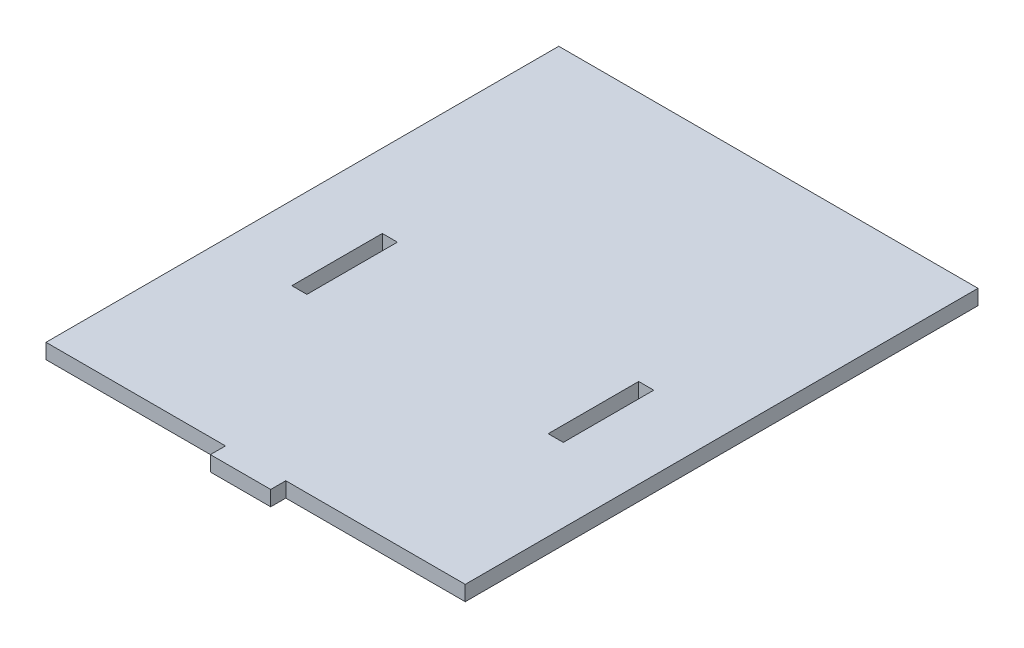
ISO-10303-21;
HEADER;
FILE_DESCRIPTION(('STEP AP214'),'2;1');
FILE_NAME('part.step','',(''),(''),'','','');
FILE_SCHEMA(('AUTOMOTIVE_DESIGN { 1 0 10303 214 1 1 1 1 }'));
ENDSEC;
DATA;
#1=APPLICATION_CONTEXT('core data for automotive mechanical design processes');
#2=APPLICATION_PROTOCOL_DEFINITION('international standard','automotive_design',2000,#1);
#3=PRODUCT_CONTEXT('',#1,'mechanical');
#4=PRODUCT('Part','Part','',(#3));
#5=PRODUCT_RELATED_PRODUCT_CATEGORY('part','',(#4));
#6=PRODUCT_DEFINITION_FORMATION('','',#4);
#7=PRODUCT_DEFINITION_CONTEXT('part definition',#1,'design');
#8=PRODUCT_DEFINITION('design','',#6,#7);
#9=PRODUCT_DEFINITION_SHAPE('','',#8);
#10=(LENGTH_UNIT() NAMED_UNIT(*) SI_UNIT(.MILLI.,.METRE.));
#11=(NAMED_UNIT(*) PLANE_ANGLE_UNIT() SI_UNIT($,.RADIAN.));
#12=(NAMED_UNIT(*) SI_UNIT($,.STERADIAN.) SOLID_ANGLE_UNIT());
#13=UNCERTAINTY_MEASURE_WITH_UNIT(LENGTH_MEASURE(1.E-05),#10,'distance_accuracy_value','');
#14=(GEOMETRIC_REPRESENTATION_CONTEXT(3) GLOBAL_UNCERTAINTY_ASSIGNED_CONTEXT((#13)) GLOBAL_UNIT_ASSIGNED_CONTEXT((#10,
#11,#12)) REPRESENTATION_CONTEXT('',''));
#15=CARTESIAN_POINT('',(0.,0.,0.));
#16=DIRECTION('',(0.,0.,1.));
#17=DIRECTION('',(1.,0.,0.));
#18=AXIS2_PLACEMENT_3D('',#15,#16,#17);
#19=CARTESIAN_POINT('',(69.5,5.,0.));
#20=DIRECTION('',(-1.,0.,0.));
#21=DIRECTION('',(0.,0.,1.));
#22=AXIS2_PLACEMENT_3D('',#19,#20,#21);
#23=PLANE('',#22);
#24=DIRECTION('',(0.,0.,-1.));
#25=VECTOR('',#24,1.);
#26=CARTESIAN_POINT('',(69.5,0.,0.));
#27=LINE('',#26,#25);
#28=CARTESIAN_POINT('',(69.5,0.,72.));
#29=VERTEX_POINT('',#28);
#30=CARTESIAN_POINT('',(69.5,0.,-98.));
#31=VERTEX_POINT('',#30);
#32=EDGE_CURVE('E211',#29,#31,#27,.T.);
#33=ORIENTED_EDGE('',*,*,#32,.T.);
#34=DIRECTION('',(0.,-1.,0.));
#35=VECTOR('',#34,1.);
#36=CARTESIAN_POINT('',(69.5,5.,-98.));
#37=LINE('',#36,#35);
#38=CARTESIAN_POINT('',(69.5,5.,-98.));
#39=VERTEX_POINT('',#38);
#40=EDGE_CURVE('E11',#39,#31,#37,.T.);
#41=ORIENTED_EDGE('',*,*,#40,.F.);
#42=DIRECTION('',(0.,0.,-1.));
#43=VECTOR('',#42,1.);
#44=CARTESIAN_POINT('',(69.5,5.,0.));
#45=LINE('',#44,#43);
#46=CARTESIAN_POINT('',(69.5,5.,72.));
#47=VERTEX_POINT('',#46);
#48=EDGE_CURVE('E338',#47,#39,#45,.T.);
#49=ORIENTED_EDGE('',*,*,#48,.F.);
#50=DIRECTION('',(0.,-1.,0.));
#51=VECTOR('',#50,1.);
#52=CARTESIAN_POINT('',(69.5,5.,72.));
#53=LINE('',#52,#51);
#54=EDGE_CURVE('E54',#47,#29,#53,.T.);
#55=ORIENTED_EDGE('',*,*,#54,.T.);
#56=EDGE_LOOP('',(#33,#41,#49,#55));
#57=FACE_BOUND('',#56,.T.);
#58=ADVANCED_FACE('F35',(#57),#23,.F.);
#59=CARTESIAN_POINT('',(0.,5.,-98.));
#60=DIRECTION('',(0.,0.,1.));
#61=DIRECTION('',(1.,0.,0.));
#62=AXIS2_PLACEMENT_3D('',#59,#60,#61);
#63=PLANE('',#62);
#64=DIRECTION('',(-1.,0.,0.));
#65=VECTOR('',#64,1.);
#66=CARTESIAN_POINT('',(0.,0.,-98.));
#67=LINE('',#66,#65);
#68=CARTESIAN_POINT('',(-69.5,0.,-98.));
#69=VERTEX_POINT('',#68);
#70=EDGE_CURVE('E213',#31,#69,#67,.T.);
#71=ORIENTED_EDGE('',*,*,#70,.T.);
#72=DIRECTION('',(0.,-1.,0.));
#73=VECTOR('',#72,1.);
#74=CARTESIAN_POINT('',(-69.5,5.,-98.));
#75=LINE('',#74,#73);
#76=CARTESIAN_POINT('',(-69.5,5.,-98.));
#77=VERTEX_POINT('',#76);
#78=EDGE_CURVE('E45',#77,#69,#75,.T.);
#79=ORIENTED_EDGE('',*,*,#78,.F.);
#80=DIRECTION('',(-1.,0.,0.));
#81=VECTOR('',#80,1.);
#82=CARTESIAN_POINT('',(0.,5.,-98.));
#83=LINE('',#82,#81);
#84=EDGE_CURVE('E334',#39,#77,#83,.T.);
#85=ORIENTED_EDGE('',*,*,#84,.F.);
#86=ORIENTED_EDGE('',*,*,#40,.T.);
#87=EDGE_LOOP('',(#71,#79,#85,#86));
#88=FACE_BOUND('',#87,.T.);
#89=ADVANCED_FACE('F281',(#88),#63,.F.);
#90=CARTESIAN_POINT('',(-69.5,5.,0.));
#91=DIRECTION('',(-1.,0.,0.));
#92=DIRECTION('',(0.,0.,1.));
#93=AXIS2_PLACEMENT_3D('',#90,#91,#92);
#94=PLANE('',#93);
#95=DIRECTION('',(0.,0.,-1.));
#96=VECTOR('',#95,1.);
#97=CARTESIAN_POINT('',(-69.5,0.,0.));
#98=LINE('',#97,#96);
#99=CARTESIAN_POINT('',(-69.5,0.,72.));
#100=VERTEX_POINT('',#99);
#101=EDGE_CURVE('E216',#100,#69,#98,.T.);
#102=ORIENTED_EDGE('',*,*,#101,.F.);
#103=DIRECTION('',(0.,-1.,0.));
#104=VECTOR('',#103,1.);
#105=CARTESIAN_POINT('',(-69.5,5.,72.));
#106=LINE('',#105,#104);
#107=CARTESIAN_POINT('',(-69.5,5.,72.));
#108=VERTEX_POINT('',#107);
#109=EDGE_CURVE('E234',#108,#100,#106,.T.);
#110=ORIENTED_EDGE('',*,*,#109,.F.);
#111=DIRECTION('',(0.,0.,-1.));
#112=VECTOR('',#111,1.);
#113=CARTESIAN_POINT('',(-69.5,5.,0.));
#114=LINE('',#113,#112);
#115=EDGE_CURVE('E333',#108,#77,#114,.T.);
#116=ORIENTED_EDGE('',*,*,#115,.T.);
#117=ORIENTED_EDGE('',*,*,#78,.T.);
#118=EDGE_LOOP('',(#102,#110,#116,#117));
#119=FACE_BOUND('',#118,.T.);
#120=ADVANCED_FACE('F286',(#119),#94,.T.);
#121=CARTESIAN_POINT('',(0.,5.,72.));
#122=DIRECTION('',(0.,0.,1.));
#123=DIRECTION('',(1.,0.,0.));
#124=AXIS2_PLACEMENT_3D('',#121,#122,#123);
#125=PLANE('',#124);
#126=DIRECTION('',(-1.,0.,0.));
#127=VECTOR('',#126,1.);
#128=CARTESIAN_POINT('',(0.,0.,72.));
#129=LINE('',#128,#127);
#130=CARTESIAN_POINT('',(-9.99999999999999,0.,72.));
#131=VERTEX_POINT('',#130);
#132=EDGE_CURVE('E219',#131,#100,#129,.T.);
#133=ORIENTED_EDGE('',*,*,#132,.F.);
#134=DIRECTION('',(0.,-1.,0.));
#135=VECTOR('',#134,1.);
#136=CARTESIAN_POINT('',(-9.99999999999999,5.,72.));
#137=LINE('',#136,#135);
#138=CARTESIAN_POINT('',(-9.99999999999999,5.,72.));
#139=VERTEX_POINT('',#138);
#140=EDGE_CURVE('E232',#139,#131,#137,.T.);
#141=ORIENTED_EDGE('',*,*,#140,.F.);
#142=DIRECTION('',(-1.,0.,0.));
#143=VECTOR('',#142,1.);
#144=CARTESIAN_POINT('',(0.,5.,72.));
#145=LINE('',#144,#143);
#146=EDGE_CURVE('E184',#139,#108,#145,.T.);
#147=ORIENTED_EDGE('',*,*,#146,.T.);
#148=ORIENTED_EDGE('',*,*,#109,.T.);
#149=EDGE_LOOP('',(#133,#141,#147,#148));
#150=FACE_BOUND('',#149,.T.);
#151=ADVANCED_FACE('F308',(#150),#125,.T.);
#152=CARTESIAN_POINT('',(-9.99999999999999,5.,0.));
#153=DIRECTION('',(1.,0.,0.));
#154=DIRECTION('',(0.,0.,-1.));
#155=AXIS2_PLACEMENT_3D('',#152,#153,#154);
#156=PLANE('',#155);
#157=DIRECTION('',(0.,0.,1.));
#158=VECTOR('',#157,1.);
#159=CARTESIAN_POINT('',(-9.99999999999999,0.,0.));
#160=LINE('',#159,#158);
#161=CARTESIAN_POINT('',(-9.99999999999999,0.,77.));
#162=VERTEX_POINT('',#161);
#163=EDGE_CURVE('E222',#131,#162,#160,.T.);
#164=ORIENTED_EDGE('',*,*,#163,.T.);
#165=DIRECTION('',(0.,-1.,0.));
#166=VECTOR('',#165,1.);
#167=CARTESIAN_POINT('',(-9.99999999999999,5.,77.));
#168=LINE('',#167,#166);
#169=CARTESIAN_POINT('',(-9.99999999999999,5.,77.));
#170=VERTEX_POINT('',#169);
#171=EDGE_CURVE('E177',#170,#162,#168,.T.);
#172=ORIENTED_EDGE('',*,*,#171,.F.);
#173=DIRECTION('',(0.,0.,1.));
#174=VECTOR('',#173,1.);
#175=CARTESIAN_POINT('',(-9.99999999999999,5.,0.));
#176=LINE('',#175,#174);
#177=EDGE_CURVE('E165',#139,#170,#176,.T.);
#178=ORIENTED_EDGE('',*,*,#177,.F.);
#179=ORIENTED_EDGE('',*,*,#140,.T.);
#180=EDGE_LOOP('',(#164,#172,#178,#179));
#181=FACE_BOUND('',#180,.T.);
#182=ADVANCED_FACE('F317',(#181),#156,.F.);
#183=CARTESIAN_POINT('',(0.,5.,77.));
#184=DIRECTION('',(0.,0.,-1.));
#185=DIRECTION('',(-1.,0.,0.));
#186=AXIS2_PLACEMENT_3D('',#183,#184,#185);
#187=PLANE('',#186);
#188=DIRECTION('',(1.,0.,0.));
#189=VECTOR('',#188,1.);
#190=CARTESIAN_POINT('',(0.,0.,77.));
#191=LINE('',#190,#189);
#192=CARTESIAN_POINT('',(10.,0.,77.));
#193=VERTEX_POINT('',#192);
#194=EDGE_CURVE('E174',#162,#193,#191,.T.);
#195=ORIENTED_EDGE('',*,*,#194,.T.);
#196=DIRECTION('',(0.,-1.,0.));
#197=VECTOR('',#196,1.);
#198=CARTESIAN_POINT('',(10.,5.,77.));
#199=LINE('',#198,#197);
#200=CARTESIAN_POINT('',(10.,5.,77.));
#201=VERTEX_POINT('',#200);
#202=EDGE_CURVE('E171',#201,#193,#199,.T.);
#203=ORIENTED_EDGE('',*,*,#202,.F.);
#204=DIRECTION('',(1.,0.,0.));
#205=VECTOR('',#204,1.);
#206=CARTESIAN_POINT('',(0.,5.,77.));
#207=LINE('',#206,#205);
#208=EDGE_CURVE('E156',#170,#201,#207,.T.);
#209=ORIENTED_EDGE('',*,*,#208,.F.);
#210=ORIENTED_EDGE('',*,*,#171,.T.);
#211=EDGE_LOOP('',(#195,#203,#209,#210));
#212=FACE_BOUND('',#211,.T.);
#213=ADVANCED_FACE('F172',(#212),#187,.F.);
#214=CARTESIAN_POINT('',(10.,5.,0.));
#215=DIRECTION('',(-1.,0.,0.));
#216=DIRECTION('',(0.,0.,1.));
#217=AXIS2_PLACEMENT_3D('',#214,#215,#216);
#218=PLANE('',#217);
#219=DIRECTION('',(0.,0.,-1.));
#220=VECTOR('',#219,1.);
#221=CARTESIAN_POINT('',(10.,0.,0.));
#222=LINE('',#221,#220);
#223=CARTESIAN_POINT('',(10.,0.,72.));
#224=VERTEX_POINT('',#223);
#225=EDGE_CURVE('E226',#193,#224,#222,.T.);
#226=ORIENTED_EDGE('',*,*,#225,.T.);
#227=DIRECTION('',(0.,-1.,0.));
#228=VECTOR('',#227,1.);
#229=CARTESIAN_POINT('',(10.,5.,72.));
#230=LINE('',#229,#228);
#231=CARTESIAN_POINT('',(10.,5.,72.));
#232=VERTEX_POINT('',#231);
#233=EDGE_CURVE('E105',#232,#224,#230,.T.);
#234=ORIENTED_EDGE('',*,*,#233,.F.);
#235=DIRECTION('',(0.,0.,-1.));
#236=VECTOR('',#235,1.);
#237=CARTESIAN_POINT('',(10.,5.,0.));
#238=LINE('',#237,#236);
#239=EDGE_CURVE('E162',#201,#232,#238,.T.);
#240=ORIENTED_EDGE('',*,*,#239,.F.);
#241=ORIENTED_EDGE('',*,*,#202,.T.);
#242=EDGE_LOOP('',(#226,#234,#240,#241));
#243=FACE_BOUND('',#242,.T.);
#244=ADVANCED_FACE('F179',(#243),#218,.F.);
#245=CARTESIAN_POINT('',(-45.,5.,0.));
#246=DIRECTION('',(1.,0.,0.));
#247=DIRECTION('',(0.,0.,-1.));
#248=AXIS2_PLACEMENT_3D('',#245,#246,#247);
#249=PLANE('',#248);
#250=DIRECTION('',(0.,0.,1.));
#251=VECTOR('',#250,1.);
#252=CARTESIAN_POINT('',(-45.,0.,0.));
#253=LINE('',#252,#251);
#254=CARTESIAN_POINT('',(-45.,0.,-15.));
#255=VERTEX_POINT('',#254);
#256=CARTESIAN_POINT('',(-45.,0.,15.));
#257=VERTEX_POINT('',#256);
#258=EDGE_CURVE('E199',#255,#257,#253,.T.);
#259=ORIENTED_EDGE('',*,*,#258,.F.);
#260=DIRECTION('',(0.,-1.,0.));
#261=VECTOR('',#260,1.);
#262=CARTESIAN_POINT('',(-45.,5.,-15.));
#263=LINE('',#262,#261);
#264=CARTESIAN_POINT('',(-45.,5.,-15.));
#265=VERTEX_POINT('',#264);
#266=EDGE_CURVE('E229',#265,#255,#263,.T.);
#267=ORIENTED_EDGE('',*,*,#266,.F.);
#268=DIRECTION('',(0.,0.,1.));
#269=VECTOR('',#268,1.);
#270=CARTESIAN_POINT('',(-45.,5.,0.));
#271=LINE('',#270,#269);
#272=CARTESIAN_POINT('',(-45.,5.,15.));
#273=VERTEX_POINT('',#272);
#274=EDGE_CURVE('E348',#265,#273,#271,.T.);
#275=ORIENTED_EDGE('',*,*,#274,.T.);
#276=DIRECTION('',(0.,-1.,0.));
#277=VECTOR('',#276,1.);
#278=CARTESIAN_POINT('',(-45.,5.,15.));
#279=LINE('',#278,#277);
#280=EDGE_CURVE('E237',#273,#257,#279,.T.);
#281=ORIENTED_EDGE('',*,*,#280,.T.);
#282=EDGE_LOOP('',(#259,#267,#275,#281));
#283=FACE_BOUND('',#282,.T.);
#284=ADVANCED_FACE('F298',(#283),#249,.T.);
#285=CARTESIAN_POINT('',(0.,5.,-15.0000000000001));
#286=DIRECTION('',(0.,0.,-1.));
#287=DIRECTION('',(-1.,0.,0.));
#288=AXIS2_PLACEMENT_3D('',#285,#286,#287);
#289=PLANE('',#288);
#290=DIRECTION('',(1.,0.,0.));
#291=VECTOR('',#290,1.);
#292=CARTESIAN_POINT('',(0.,0.,-15.0000000000001));
#293=LINE('',#292,#291);
#294=CARTESIAN_POINT('',(-40.,0.,-15.));
#295=VERTEX_POINT('',#294);
#296=EDGE_CURVE('E202',#255,#295,#293,.T.);
#297=ORIENTED_EDGE('',*,*,#296,.T.);
#298=DIRECTION('',(0.,-1.,0.));
#299=VECTOR('',#298,1.);
#300=CARTESIAN_POINT('',(-40.,5.,-15.));
#301=LINE('',#300,#299);
#302=CARTESIAN_POINT('',(-40.,5.,-15.));
#303=VERTEX_POINT('',#302);
#304=EDGE_CURVE('E242',#303,#295,#301,.T.);
#305=ORIENTED_EDGE('',*,*,#304,.F.);
#306=DIRECTION('',(1.,0.,0.));
#307=VECTOR('',#306,1.);
#308=CARTESIAN_POINT('',(0.,5.,-15.0000000000001));
#309=LINE('',#308,#307);
#310=EDGE_CURVE('E345',#265,#303,#309,.T.);
#311=ORIENTED_EDGE('',*,*,#310,.F.);
#312=ORIENTED_EDGE('',*,*,#266,.T.);
#313=EDGE_LOOP('',(#297,#305,#311,#312));
#314=FACE_BOUND('',#313,.T.);
#315=ADVANCED_FACE('F294',(#314),#289,.F.);
#316=CARTESIAN_POINT('',(-40.,5.,0.));
#317=DIRECTION('',(1.,0.,0.));
#318=DIRECTION('',(0.,0.,-1.));
#319=AXIS2_PLACEMENT_3D('',#316,#317,#318);
#320=PLANE('',#319);
#321=DIRECTION('',(0.,0.,1.));
#322=VECTOR('',#321,1.);
#323=CARTESIAN_POINT('',(-40.,0.,0.));
#324=LINE('',#323,#322);
#325=CARTESIAN_POINT('',(-40.,0.,15.));
#326=VERTEX_POINT('',#325);
#327=EDGE_CURVE('E205',#295,#326,#324,.T.);
#328=ORIENTED_EDGE('',*,*,#327,.T.);
#329=DIRECTION('',(0.,-1.,0.));
#330=VECTOR('',#329,1.);
#331=CARTESIAN_POINT('',(-40.,5.,15.));
#332=LINE('',#331,#330);
#333=CARTESIAN_POINT('',(-40.,5.,15.));
#334=VERTEX_POINT('',#333);
#335=EDGE_CURVE('E239',#334,#326,#332,.T.);
#336=ORIENTED_EDGE('',*,*,#335,.F.);
#337=DIRECTION('',(0.,0.,1.));
#338=VECTOR('',#337,1.);
#339=CARTESIAN_POINT('',(-40.,5.,0.));
#340=LINE('',#339,#338);
#341=EDGE_CURVE('E342',#303,#334,#340,.T.);
#342=ORIENTED_EDGE('',*,*,#341,.F.);
#343=ORIENTED_EDGE('',*,*,#304,.T.);
#344=EDGE_LOOP('',(#328,#336,#342,#343));
#345=FACE_BOUND('',#344,.T.);
#346=ADVANCED_FACE('F291',(#345),#320,.F.);
#347=CARTESIAN_POINT('',(0.,5.,-15.0000000000001));
#348=DIRECTION('',(0.,0.,1.));
#349=DIRECTION('',(1.,0.,0.));
#350=AXIS2_PLACEMENT_3D('',#347,#348,#349);
#351=PLANE('',#350);
#352=DIRECTION('',(-1.,0.,0.));
#353=VECTOR('',#352,1.);
#354=CARTESIAN_POINT('',(0.,0.,-15.0000000000001));
#355=LINE('',#354,#353);
#356=CARTESIAN_POINT('',(45.,0.,-15.));
#357=VERTEX_POINT('',#356);
#358=CARTESIAN_POINT('',(40.,0.,-15.));
#359=VERTEX_POINT('',#358);
#360=EDGE_CURVE('E187',#357,#359,#355,.T.);
#361=ORIENTED_EDGE('',*,*,#360,.F.);
#362=DIRECTION('',(0.,-1.,0.));
#363=VECTOR('',#362,1.);
#364=CARTESIAN_POINT('',(45.,5.,-15.));
#365=LINE('',#364,#363);
#366=CARTESIAN_POINT('',(45.,5.,-15.));
#367=VERTEX_POINT('',#366);
#368=EDGE_CURVE('E39',#367,#357,#365,.T.);
#369=ORIENTED_EDGE('',*,*,#368,.F.);
#370=DIRECTION('',(-1.,0.,0.));
#371=VECTOR('',#370,1.);
#372=CARTESIAN_POINT('',(0.,5.,-15.0000000000001));
#373=LINE('',#372,#371);
#374=CARTESIAN_POINT('',(40.,5.,-15.));
#375=VERTEX_POINT('',#374);
#376=EDGE_CURVE('E262',#367,#375,#373,.T.);
#377=ORIENTED_EDGE('',*,*,#376,.T.);
#378=DIRECTION('',(0.,-1.,0.));
#379=VECTOR('',#378,1.);
#380=CARTESIAN_POINT('',(40.,5.,-15.));
#381=LINE('',#380,#379);
#382=EDGE_CURVE('E182',#375,#359,#381,.T.);
#383=ORIENTED_EDGE('',*,*,#382,.T.);
#384=EDGE_LOOP('',(#361,#369,#377,#383));
#385=FACE_BOUND('',#384,.T.);
#386=ADVANCED_FACE('F37',(#385),#351,.T.);
#387=CARTESIAN_POINT('',(45.,5.,0.));
#388=DIRECTION('',(1.,0.,0.));
#389=DIRECTION('',(0.,0.,-1.));
#390=AXIS2_PLACEMENT_3D('',#387,#388,#389);
#391=PLANE('',#390);
#392=DIRECTION('',(0.,0.,1.));
#393=VECTOR('',#392,1.);
#394=CARTESIAN_POINT('',(45.,0.,0.));
#395=LINE('',#394,#393);
#396=CARTESIAN_POINT('',(45.,0.,15.));
#397=VERTEX_POINT('',#396);
#398=EDGE_CURVE('E190',#357,#397,#395,.T.);
#399=ORIENTED_EDGE('',*,*,#398,.T.);
#400=DIRECTION('',(0.,-1.,0.));
#401=VECTOR('',#400,1.);
#402=CARTESIAN_POINT('',(45.,5.,15.));
#403=LINE('',#402,#401);
#404=CARTESIAN_POINT('',(45.,5.,15.));
#405=VERTEX_POINT('',#404);
#406=EDGE_CURVE('E248',#405,#397,#403,.T.);
#407=ORIENTED_EDGE('',*,*,#406,.F.);
#408=DIRECTION('',(0.,0.,1.));
#409=VECTOR('',#408,1.);
#410=CARTESIAN_POINT('',(45.,5.,0.));
#411=LINE('',#410,#409);
#412=EDGE_CURVE('E256',#367,#405,#411,.T.);
#413=ORIENTED_EDGE('',*,*,#412,.F.);
#414=ORIENTED_EDGE('',*,*,#368,.T.);
#415=EDGE_LOOP('',(#399,#407,#413,#414));
#416=FACE_BOUND('',#415,.T.);
#417=ADVANCED_FACE('F255',(#416),#391,.F.);
#418=CARTESIAN_POINT('',(0.,5.,14.9999999999999));
#419=DIRECTION('',(0.,0.,-1.));
#420=DIRECTION('',(-1.,0.,0.));
#421=AXIS2_PLACEMENT_3D('',#418,#419,#420);
#422=PLANE('',#421);
#423=DIRECTION('',(1.,0.,0.));
#424=VECTOR('',#423,1.);
#425=CARTESIAN_POINT('',(0.,0.,14.9999999999999));
#426=LINE('',#425,#424);
#427=CARTESIAN_POINT('',(40.,0.,15.));
#428=VERTEX_POINT('',#427);
#429=EDGE_CURVE('E193',#428,#397,#426,.T.);
#430=ORIENTED_EDGE('',*,*,#429,.F.);
#431=DIRECTION('',(0.,-1.,0.));
#432=VECTOR('',#431,1.);
#433=CARTESIAN_POINT('',(40.,5.,15.));
#434=LINE('',#433,#432);
#435=CARTESIAN_POINT('',(40.,5.,15.));
#436=VERTEX_POINT('',#435);
#437=EDGE_CURVE('E247',#436,#428,#434,.T.);
#438=ORIENTED_EDGE('',*,*,#437,.F.);
#439=DIRECTION('',(1.,0.,0.));
#440=VECTOR('',#439,1.);
#441=CARTESIAN_POINT('',(0.,5.,14.9999999999999));
#442=LINE('',#441,#440);
#443=EDGE_CURVE('E352',#436,#405,#442,.T.);
#444=ORIENTED_EDGE('',*,*,#443,.T.);
#445=ORIENTED_EDGE('',*,*,#406,.T.);
#446=EDGE_LOOP('',(#430,#438,#444,#445));
#447=FACE_BOUND('',#446,.T.);
#448=ADVANCED_FACE('F269',(#447),#422,.T.);
#449=CARTESIAN_POINT('',(0.,5.,14.9999999999999));
#450=DIRECTION('',(0.,0.,1.));
#451=DIRECTION('',(1.,0.,0.));
#452=AXIS2_PLACEMENT_3D('',#449,#450,#451);
#453=PLANE('',#452);
#454=DIRECTION('',(-1.,0.,0.));
#455=VECTOR('',#454,1.);
#456=CARTESIAN_POINT('',(0.,0.,14.9999999999999));
#457=LINE('',#456,#455);
#458=EDGE_CURVE('E208',#326,#257,#457,.T.);
#459=ORIENTED_EDGE('',*,*,#458,.T.);
#460=ORIENTED_EDGE('',*,*,#280,.F.);
#461=DIRECTION('',(-1.,0.,0.));
#462=VECTOR('',#461,1.);
#463=CARTESIAN_POINT('',(0.,5.,14.9999999999999));
#464=LINE('',#463,#462);
#465=EDGE_CURVE('E340',#334,#273,#464,.T.);
#466=ORIENTED_EDGE('',*,*,#465,.F.);
#467=ORIENTED_EDGE('',*,*,#335,.T.);
#468=EDGE_LOOP('',(#459,#460,#466,#467));
#469=FACE_BOUND('',#468,.T.);
#470=ADVANCED_FACE('F271',(#469),#453,.F.);
#471=CARTESIAN_POINT('',(40.,5.,0.));
#472=DIRECTION('',(1.,0.,0.));
#473=DIRECTION('',(0.,0.,-1.));
#474=AXIS2_PLACEMENT_3D('',#471,#472,#473);
#475=PLANE('',#474);
#476=DIRECTION('',(0.,0.,1.));
#477=VECTOR('',#476,1.);
#478=CARTESIAN_POINT('',(40.,0.,0.));
#479=LINE('',#478,#477);
#480=EDGE_CURVE('E196',#359,#428,#479,.T.);
#481=ORIENTED_EDGE('',*,*,#480,.F.);
#482=ORIENTED_EDGE('',*,*,#382,.F.);
#483=DIRECTION('',(0.,0.,1.));
#484=VECTOR('',#483,1.);
#485=CARTESIAN_POINT('',(40.,5.,0.));
#486=LINE('',#485,#484);
#487=EDGE_CURVE('E267',#375,#436,#486,.T.);
#488=ORIENTED_EDGE('',*,*,#487,.T.);
#489=ORIENTED_EDGE('',*,*,#437,.T.);
#490=EDGE_LOOP('',(#481,#482,#488,#489));
#491=FACE_BOUND('',#490,.T.);
#492=ADVANCED_FACE('F266',(#491),#475,.T.);
#493=EDGE_CURVE('E223',#29,#224,#129,.T.);
#494=ORIENTED_EDGE('',*,*,#493,.F.);
#495=ORIENTED_EDGE('',*,*,#54,.F.);
#496=EDGE_CURVE('E180',#47,#232,#145,.T.);
#497=ORIENTED_EDGE('',*,*,#496,.T.);
#498=ORIENTED_EDGE('',*,*,#233,.T.);
#499=EDGE_LOOP('',(#494,#495,#497,#498));
#500=FACE_BOUND('',#499,.T.);
#501=ADVANCED_FACE('F303',(#500),#125,.T.);
#502=CARTESIAN_POINT('',(0.,5.,0.));
#503=DIRECTION('',(0.,1.,0.));
#504=DIRECTION('',(0.,0.,1.));
#505=AXIS2_PLACEMENT_3D('',#502,#503,#504);
#506=PLANE('',#505);
#507=ORIENTED_EDGE('',*,*,#376,.F.);
#508=ORIENTED_EDGE('',*,*,#412,.T.);
#509=ORIENTED_EDGE('',*,*,#443,.F.);
#510=ORIENTED_EDGE('',*,*,#487,.F.);
#511=EDGE_LOOP('',(#507,#508,#509,#510));
#512=FACE_BOUND('',#511,.T.);
#513=ORIENTED_EDGE('',*,*,#274,.F.);
#514=ORIENTED_EDGE('',*,*,#310,.T.);
#515=ORIENTED_EDGE('',*,*,#341,.T.);
#516=ORIENTED_EDGE('',*,*,#465,.T.);
#517=EDGE_LOOP('',(#513,#514,#515,#516));
#518=FACE_BOUND('',#517,.T.);
#519=ORIENTED_EDGE('',*,*,#48,.T.);
#520=ORIENTED_EDGE('',*,*,#84,.T.);
#521=ORIENTED_EDGE('',*,*,#115,.F.);
#522=ORIENTED_EDGE('',*,*,#146,.F.);
#523=ORIENTED_EDGE('',*,*,#177,.T.);
#524=ORIENTED_EDGE('',*,*,#208,.T.);
#525=ORIENTED_EDGE('',*,*,#239,.T.);
#526=ORIENTED_EDGE('',*,*,#496,.F.);
#527=EDGE_LOOP('',(#519,#520,#521,#522,#523,#524,#525,#526));
#528=FACE_BOUND('',#527,.T.);
#529=ADVANCED_FACE('F159',(#512,#518,#528),#506,.T.);
#530=CARTESIAN_POINT('',(0.,0.,0.));
#531=DIRECTION('',(0.,1.,0.));
#532=DIRECTION('',(0.,0.,1.));
#533=AXIS2_PLACEMENT_3D('',#530,#531,#532);
#534=PLANE('',#533);
#535=ORIENTED_EDGE('',*,*,#360,.T.);
#536=ORIENTED_EDGE('',*,*,#480,.T.);
#537=ORIENTED_EDGE('',*,*,#429,.T.);
#538=ORIENTED_EDGE('',*,*,#398,.F.);
#539=EDGE_LOOP('',(#535,#536,#537,#538));
#540=FACE_BOUND('',#539,.T.);
#541=ORIENTED_EDGE('',*,*,#258,.T.);
#542=ORIENTED_EDGE('',*,*,#458,.F.);
#543=ORIENTED_EDGE('',*,*,#327,.F.);
#544=ORIENTED_EDGE('',*,*,#296,.F.);
#545=EDGE_LOOP('',(#541,#542,#543,#544));
#546=FACE_BOUND('',#545,.T.);
#547=ORIENTED_EDGE('',*,*,#32,.F.);
#548=ORIENTED_EDGE('',*,*,#493,.T.);
#549=ORIENTED_EDGE('',*,*,#225,.F.);
#550=ORIENTED_EDGE('',*,*,#194,.F.);
#551=ORIENTED_EDGE('',*,*,#163,.F.);
#552=ORIENTED_EDGE('',*,*,#132,.T.);
#553=ORIENTED_EDGE('',*,*,#101,.T.);
#554=ORIENTED_EDGE('',*,*,#70,.F.);
#555=EDGE_LOOP('',(#547,#548,#549,#550,#551,#552,#553,#554));
#556=FACE_BOUND('',#555,.T.);
#557=ADVANCED_FACE('F259',(#540,#546,#556),#534,.F.);
#558=CLOSED_SHELL('',(#58,#89,#120,#151,#182,#213,#244,#284,#315,#346,#386,#417,#448,#470,#492,
#501,#529,#557));
#559=MANIFOLD_SOLID_BREP('B2',#558);
#560=ADVANCED_BREP_SHAPE_REPRESENTATION('',(#18,#559),#14);
#561=SHAPE_DEFINITION_REPRESENTATION(#9,#560);
ENDSEC;
END-ISO-10303-21;
